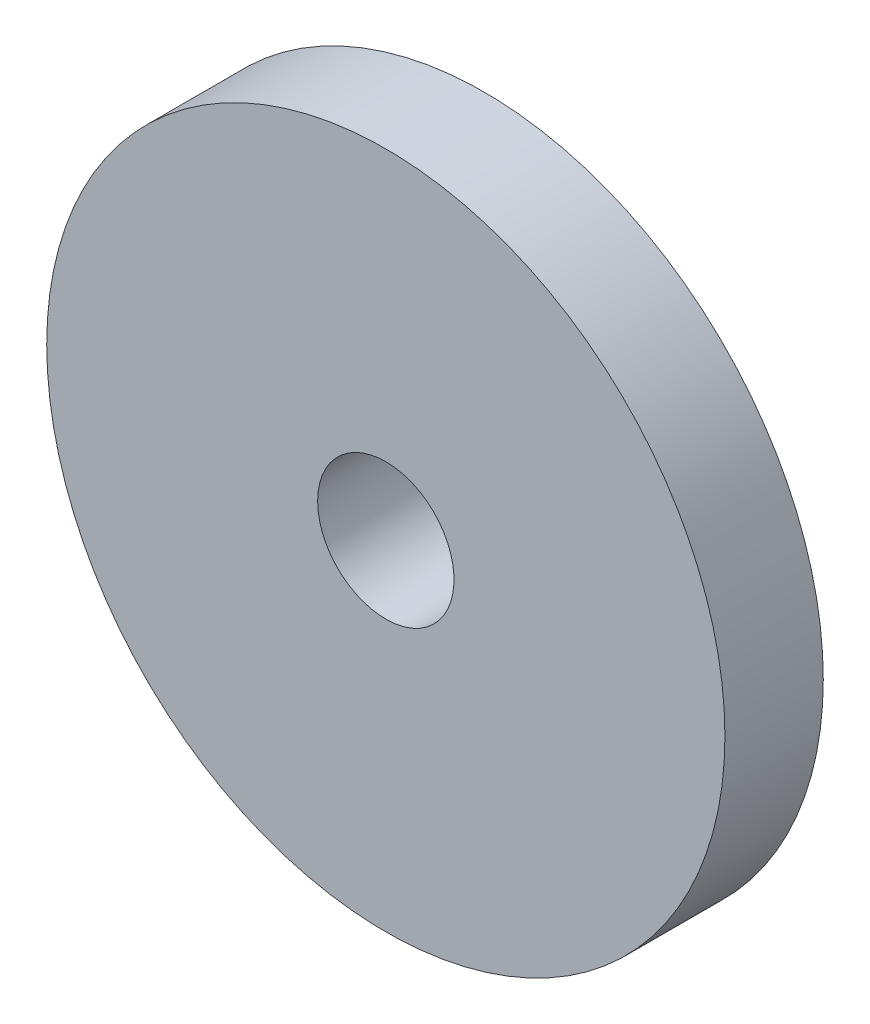
ISO-10303-21;
HEADER;
FILE_DESCRIPTION(('STEP AP214'),'2;1');
FILE_NAME('part.step','',(''),(''),'','','');
FILE_SCHEMA(('AUTOMOTIVE_DESIGN { 1 0 10303 214 1 1 1 1 }'));
ENDSEC;
DATA;
#1=APPLICATION_CONTEXT('core data for automotive mechanical design processes');
#2=APPLICATION_PROTOCOL_DEFINITION('international standard','automotive_design',2000,#1);
#3=PRODUCT_CONTEXT('',#1,'mechanical');
#4=PRODUCT('Part','Part','',(#3));
#5=PRODUCT_RELATED_PRODUCT_CATEGORY('part','',(#4));
#6=PRODUCT_DEFINITION_FORMATION('','',#4);
#7=PRODUCT_DEFINITION_CONTEXT('part definition',#1,'design');
#8=PRODUCT_DEFINITION('design','',#6,#7);
#9=PRODUCT_DEFINITION_SHAPE('','',#8);
#10=(LENGTH_UNIT() NAMED_UNIT(*) SI_UNIT(.MILLI.,.METRE.));
#11=(NAMED_UNIT(*) PLANE_ANGLE_UNIT() SI_UNIT($,.RADIAN.));
#12=(NAMED_UNIT(*) SI_UNIT($,.STERADIAN.) SOLID_ANGLE_UNIT());
#13=UNCERTAINTY_MEASURE_WITH_UNIT(LENGTH_MEASURE(1.E-05),#10,'distance_accuracy_value','');
#14=(GEOMETRIC_REPRESENTATION_CONTEXT(3) GLOBAL_UNCERTAINTY_ASSIGNED_CONTEXT((#13)) GLOBAL_UNIT_ASSIGNED_CONTEXT((#10,
#11,#12)) REPRESENTATION_CONTEXT('',''));
#15=CARTESIAN_POINT('',(0.,0.,0.));
#16=DIRECTION('',(0.,0.,1.));
#17=DIRECTION('',(1.,0.,0.));
#18=AXIS2_PLACEMENT_3D('',#15,#16,#17);
#19=CARTESIAN_POINT('',(0.,0.,4.7625));
#20=DIRECTION('',(0.,0.,1.));
#21=DIRECTION('',(1.,0.,0.));
#22=AXIS2_PLACEMENT_3D('',#19,#20,#21);
#23=PLANE('',#22);
#24=CARTESIAN_POINT('',(0.,0.,4.7625));
#25=DIRECTION('',(0.,0.,1.));
#26=DIRECTION('',(1.,0.,0.));
#27=AXIS2_PLACEMENT_3D('',#24,#25,#26);
#28=CIRCLE('',#27,16.4211);
#29=CARTESIAN_POINT('',(-16.4211,0.,4.7625));
#30=VERTEX_POINT('',#29);
#31=EDGE_CURVE('E10',#30,#30,#28,.T.);
#32=ORIENTED_EDGE('',*,*,#31,.T.);
#33=EDGE_LOOP('',(#32));
#34=FACE_BOUND('',#33,.T.);
#35=CARTESIAN_POINT('',(0.,0.,4.7625));
#36=DIRECTION('',(0.,0.,1.));
#37=DIRECTION('',(1.,0.,0.));
#38=AXIS2_PLACEMENT_3D('',#35,#36,#37);
#39=CIRCLE('',#38,3.302);
#40=CARTESIAN_POINT('',(-3.302,0.,4.7625));
#41=VERTEX_POINT('',#40);
#42=EDGE_CURVE('E42',#41,#41,#39,.T.);
#43=ORIENTED_EDGE('',*,*,#42,.F.);
#44=EDGE_LOOP('',(#43));
#45=FACE_BOUND('',#44,.T.);
#46=ADVANCED_FACE('F31',(#34,#45),#23,.T.);
#47=CARTESIAN_POINT('',(0.,0.,0.));
#48=DIRECTION('',(0.,0.,1.));
#49=DIRECTION('',(1.,0.,0.));
#50=AXIS2_PLACEMENT_3D('',#47,#48,#49);
#51=PLANE('',#50);
#52=CARTESIAN_POINT('',(0.,0.,0.));
#53=DIRECTION('',(0.,0.,1.));
#54=DIRECTION('',(1.,0.,0.));
#55=AXIS2_PLACEMENT_3D('',#52,#53,#54);
#56=CIRCLE('',#55,16.4211);
#57=CARTESIAN_POINT('',(-16.4211,0.,0.));
#58=VERTEX_POINT('',#57);
#59=EDGE_CURVE('E35',#58,#58,#56,.T.);
#60=ORIENTED_EDGE('',*,*,#59,.F.);
#61=EDGE_LOOP('',(#60));
#62=FACE_BOUND('',#61,.T.);
#63=CARTESIAN_POINT('',(0.,0.,0.));
#64=DIRECTION('',(0.,0.,1.));
#65=DIRECTION('',(1.,0.,0.));
#66=AXIS2_PLACEMENT_3D('',#63,#64,#65);
#67=CIRCLE('',#66,3.302);
#68=CARTESIAN_POINT('',(-3.302,0.,0.));
#69=VERTEX_POINT('',#68);
#70=EDGE_CURVE('E44',#69,#69,#67,.T.);
#71=ORIENTED_EDGE('',*,*,#70,.T.);
#72=EDGE_LOOP('',(#71));
#73=FACE_BOUND('',#72,.T.);
#74=ADVANCED_FACE('F54',(#62,#73),#51,.F.);
#75=CARTESIAN_POINT('',(0.,0.,4.7625));
#76=DIRECTION('',(0.,0.,-1.));
#77=DIRECTION('',(-1.,0.,0.));
#78=AXIS2_PLACEMENT_3D('',#75,#76,#77);
#79=CYLINDRICAL_SURFACE('',#78,16.4211);
#80=CARTESIAN_POINT('',(-16.4211,0.,4.7625));
#81=CARTESIAN_POINT('',(-16.4211,0.,4.712890625));
#82=CARTESIAN_POINT('',(-16.4211,0.,4.66328125));
#83=CARTESIAN_POINT('',(-16.4211,0.,4.5640625));
#84=CARTESIAN_POINT('',(-16.4211,0.,4.514453125));
#85=CARTESIAN_POINT('',(-16.4211,0.,4.415234375));
#86=CARTESIAN_POINT('',(-16.4211,0.,4.365625));
#87=CARTESIAN_POINT('',(-16.4211,0.,4.26640625));
#88=CARTESIAN_POINT('',(-16.4211,0.,4.216796875));
#89=CARTESIAN_POINT('',(-16.4211,0.,4.117578125));
#90=CARTESIAN_POINT('',(-16.4211,0.,4.06796875));
#91=CARTESIAN_POINT('',(-16.4211,0.,3.96875));
#92=CARTESIAN_POINT('',(-16.4211,0.,3.919140625));
#93=CARTESIAN_POINT('',(-16.4211,0.,3.819921875));
#94=CARTESIAN_POINT('',(-16.4211,0.,3.7703125));
#95=CARTESIAN_POINT('',(-16.4211,0.,3.67109375));
#96=CARTESIAN_POINT('',(-16.4211,0.,3.621484375));
#97=CARTESIAN_POINT('',(-16.4211,0.,3.522265625));
#98=CARTESIAN_POINT('',(-16.4211,0.,3.47265625));
#99=CARTESIAN_POINT('',(-16.4211,0.,3.3734375));
#100=CARTESIAN_POINT('',(-16.4211,0.,3.323828125));
#101=CARTESIAN_POINT('',(-16.4211,0.,3.224609375));
#102=CARTESIAN_POINT('',(-16.4211,0.,3.175));
#103=CARTESIAN_POINT('',(-16.4211,0.,3.07578125));
#104=CARTESIAN_POINT('',(-16.4211,0.,3.026171875));
#105=CARTESIAN_POINT('',(-16.4211,0.,2.926953125));
#106=CARTESIAN_POINT('',(-16.4211,0.,2.87734375));
#107=CARTESIAN_POINT('',(-16.4211,0.,2.778125));
#108=CARTESIAN_POINT('',(-16.4211,0.,2.728515625));
#109=CARTESIAN_POINT('',(-16.4211,0.,2.629296875));
#110=CARTESIAN_POINT('',(-16.4211,0.,2.5796875));
#111=CARTESIAN_POINT('',(-16.4211,0.,2.48046875));
#112=CARTESIAN_POINT('',(-16.4211,0.,2.430859375));
#113=CARTESIAN_POINT('',(-16.4211,0.,2.331640625));
#114=CARTESIAN_POINT('',(-16.4211,0.,2.28203125));
#115=CARTESIAN_POINT('',(-16.4211,0.,2.1828125));
#116=CARTESIAN_POINT('',(-16.4211,0.,2.133203125));
#117=CARTESIAN_POINT('',(-16.4211,0.,2.033984375));
#118=CARTESIAN_POINT('',(-16.4211,0.,1.984375));
#119=CARTESIAN_POINT('',(-16.4211,0.,1.88515625));
#120=CARTESIAN_POINT('',(-16.4211,0.,1.835546875));
#121=CARTESIAN_POINT('',(-16.4211,0.,1.736328125));
#122=CARTESIAN_POINT('',(-16.4211,0.,1.68671875));
#123=CARTESIAN_POINT('',(-16.4211,0.,1.5875));
#124=CARTESIAN_POINT('',(-16.4211,0.,1.537890625));
#125=CARTESIAN_POINT('',(-16.4211,0.,1.438671875));
#126=CARTESIAN_POINT('',(-16.4211,0.,1.3890625));
#127=CARTESIAN_POINT('',(-16.4211,0.,1.28984375));
#128=CARTESIAN_POINT('',(-16.4211,0.,1.240234375));
#129=CARTESIAN_POINT('',(-16.4211,0.,1.141015625));
#130=CARTESIAN_POINT('',(-16.4211,0.,1.09140625));
#131=CARTESIAN_POINT('',(-16.4211,0.,0.992187499999999));
#132=CARTESIAN_POINT('',(-16.4211,0.,0.942578124999999));
#133=CARTESIAN_POINT('',(-16.4211,0.,0.843359375));
#134=CARTESIAN_POINT('',(-16.4211,0.,0.79375));
#135=CARTESIAN_POINT('',(-16.4211,0.,0.69453125));
#136=CARTESIAN_POINT('',(-16.4211,0.,0.644921875));
#137=CARTESIAN_POINT('',(-16.4211,0.,0.545703125));
#138=CARTESIAN_POINT('',(-16.4211,0.,0.49609375));
#139=CARTESIAN_POINT('',(-16.4211,0.,0.396875));
#140=CARTESIAN_POINT('',(-16.4211,0.,0.347265625));
#141=CARTESIAN_POINT('',(-16.4211,0.,0.248046875));
#142=CARTESIAN_POINT('',(-16.4211,0.,0.1984375));
#143=CARTESIAN_POINT('',(-16.4211,0.,0.09921875));
#144=CARTESIAN_POINT('',(-16.4211,0.,0.049609375));
#145=CARTESIAN_POINT('',(-16.4211,0.,0.));
#146=B_SPLINE_CURVE_WITH_KNOTS('',3,(#80,#81,#82,#83,#84,#85,#86,#87,#88,#89,#90,#91,#92,#93,
#94,#95,#96,#97,#98,#99,#100,#101,#102,#103,#104,#105,#106,#107,#108,#109,#110,#111,#112,#113,
#114,#115,#116,#117,#118,#119,#120,#121,#122,#123,#124,#125,#126,#127,#128,#129,#130,#131,#132,
#133,#134,#135,#136,#137,#138,#139,#140,#141,#142,#143,#144,#145),.UNSPECIFIED.,.F.,.F.,(4,2,2,
2,2,2,2,2,2,2,2,2,2,2,2,2,2,2,2,2,2,2,2,2,2,2,2,2,2,2,2,2,4),(0.,0.148828125,0.29765625,
0.446484375,0.5953125,0.744140625,0.892968750000001,1.041796875,1.190625,1.339453125,1.48828125,
1.637109375,1.7859375,1.934765625,2.08359375,2.232421875,2.38125,2.530078125,2.67890625,
2.827734375,2.9765625,3.125390625,3.27421875,3.423046875,3.571875,3.720703125,3.86953125,
4.018359375,4.1671875,4.316015625,4.46484375,4.613671875,4.7625),.UNSPECIFIED.);
#147=EDGE_CURVE('BSEAM33',#30,#58,#146,.T.);
#148=ORIENTED_EDGE('',*,*,#31,.F.);
#149=ORIENTED_EDGE('',*,*,#59,.T.);
#150=ORIENTED_EDGE('',*,*,#147,.T.);
#151=ORIENTED_EDGE('',*,*,#147,.F.);
#152=EDGE_LOOP('',(#148,#150,#149,#151));
#153=FACE_BOUND('',#152,.T.);
#154=ADVANCED_FACE('F33',(#153),#79,.T.);
#155=CARTESIAN_POINT('',(0.,0.,4.7625));
#156=DIRECTION('',(0.,0.,-1.));
#157=DIRECTION('',(-1.,0.,0.));
#158=AXIS2_PLACEMENT_3D('',#155,#156,#157);
#159=CYLINDRICAL_SURFACE('',#158,3.302);
#160=CARTESIAN_POINT('',(-3.302,0.,4.7625));
#161=CARTESIAN_POINT('',(-3.302,0.,4.712890625));
#162=CARTESIAN_POINT('',(-3.302,0.,4.66328125));
#163=CARTESIAN_POINT('',(-3.302,0.,4.5640625));
#164=CARTESIAN_POINT('',(-3.302,0.,4.514453125));
#165=CARTESIAN_POINT('',(-3.302,0.,4.415234375));
#166=CARTESIAN_POINT('',(-3.302,0.,4.365625));
#167=CARTESIAN_POINT('',(-3.302,0.,4.26640625));
#168=CARTESIAN_POINT('',(-3.302,0.,4.216796875));
#169=CARTESIAN_POINT('',(-3.302,0.,4.117578125));
#170=CARTESIAN_POINT('',(-3.302,0.,4.06796875));
#171=CARTESIAN_POINT('',(-3.302,0.,3.96875));
#172=CARTESIAN_POINT('',(-3.302,0.,3.919140625));
#173=CARTESIAN_POINT('',(-3.302,0.,3.819921875));
#174=CARTESIAN_POINT('',(-3.302,0.,3.7703125));
#175=CARTESIAN_POINT('',(-3.302,0.,3.67109375));
#176=CARTESIAN_POINT('',(-3.302,0.,3.621484375));
#177=CARTESIAN_POINT('',(-3.302,0.,3.522265625));
#178=CARTESIAN_POINT('',(-3.302,0.,3.47265625));
#179=CARTESIAN_POINT('',(-3.302,0.,3.3734375));
#180=CARTESIAN_POINT('',(-3.302,0.,3.323828125));
#181=CARTESIAN_POINT('',(-3.302,0.,3.224609375));
#182=CARTESIAN_POINT('',(-3.302,0.,3.175));
#183=CARTESIAN_POINT('',(-3.302,0.,3.07578125));
#184=CARTESIAN_POINT('',(-3.302,0.,3.026171875));
#185=CARTESIAN_POINT('',(-3.302,0.,2.926953125));
#186=CARTESIAN_POINT('',(-3.302,0.,2.87734375));
#187=CARTESIAN_POINT('',(-3.302,0.,2.778125));
#188=CARTESIAN_POINT('',(-3.302,0.,2.728515625));
#189=CARTESIAN_POINT('',(-3.302,0.,2.629296875));
#190=CARTESIAN_POINT('',(-3.302,0.,2.5796875));
#191=CARTESIAN_POINT('',(-3.302,0.,2.48046875));
#192=CARTESIAN_POINT('',(-3.302,0.,2.430859375));
#193=CARTESIAN_POINT('',(-3.302,0.,2.331640625));
#194=CARTESIAN_POINT('',(-3.302,0.,2.28203125));
#195=CARTESIAN_POINT('',(-3.302,0.,2.1828125));
#196=CARTESIAN_POINT('',(-3.302,0.,2.133203125));
#197=CARTESIAN_POINT('',(-3.302,0.,2.033984375));
#198=CARTESIAN_POINT('',(-3.302,0.,1.984375));
#199=CARTESIAN_POINT('',(-3.302,0.,1.88515625));
#200=CARTESIAN_POINT('',(-3.302,0.,1.835546875));
#201=CARTESIAN_POINT('',(-3.302,0.,1.736328125));
#202=CARTESIAN_POINT('',(-3.302,0.,1.68671875));
#203=CARTESIAN_POINT('',(-3.302,0.,1.5875));
#204=CARTESIAN_POINT('',(-3.302,0.,1.537890625));
#205=CARTESIAN_POINT('',(-3.302,0.,1.438671875));
#206=CARTESIAN_POINT('',(-3.302,0.,1.3890625));
#207=CARTESIAN_POINT('',(-3.302,0.,1.28984375));
#208=CARTESIAN_POINT('',(-3.302,0.,1.240234375));
#209=CARTESIAN_POINT('',(-3.302,0.,1.141015625));
#210=CARTESIAN_POINT('',(-3.302,0.,1.09140625));
#211=CARTESIAN_POINT('',(-3.302,0.,0.9921875));
#212=CARTESIAN_POINT('',(-3.302,0.,0.942578125));
#213=CARTESIAN_POINT('',(-3.302,0.,0.843359375));
#214=CARTESIAN_POINT('',(-3.302,0.,0.79375));
#215=CARTESIAN_POINT('',(-3.302,0.,0.69453125));
#216=CARTESIAN_POINT('',(-3.302,0.,0.644921875));
#217=CARTESIAN_POINT('',(-3.302,0.,0.545703125));
#218=CARTESIAN_POINT('',(-3.302,0.,0.49609375));
#219=CARTESIAN_POINT('',(-3.302,0.,0.396875));
#220=CARTESIAN_POINT('',(-3.302,0.,0.347265625));
#221=CARTESIAN_POINT('',(-3.302,0.,0.248046875));
#222=CARTESIAN_POINT('',(-3.302,0.,0.1984375));
#223=CARTESIAN_POINT('',(-3.302,0.,0.09921875));
#224=CARTESIAN_POINT('',(-3.302,0.,0.049609375));
#225=CARTESIAN_POINT('',(-3.302,0.,0.));
#226=B_SPLINE_CURVE_WITH_KNOTS('',3,(#160,#161,#162,#163,#164,#165,#166,#167,#168,#169,#170,
#171,#172,#173,#174,#175,#176,#177,#178,#179,#180,#181,#182,#183,#184,#185,#186,#187,#188,#189,
#190,#191,#192,#193,#194,#195,#196,#197,#198,#199,#200,#201,#202,#203,#204,#205,#206,#207,#208,
#209,#210,#211,#212,#213,#214,#215,#216,#217,#218,#219,#220,#221,#222,#223,#224,#225),
.UNSPECIFIED.,.F.,.F.,(4,2,2,2,2,2,2,2,2,2,2,2,2,2,2,2,2,2,2,2,2,2,2,2,2,2,2,2,2,2,2,2,4),(0.,
0.148828124999999,0.297656249999999,0.446484374999999,0.595312499999999,0.744140625,0.89296875,
1.041796875,1.190625,1.339453125,1.48828125,1.637109375,1.7859375,1.934765625,2.08359375,
2.232421875,2.38125,2.530078125,2.67890625,2.827734375,2.9765625,3.125390625,3.27421875,
3.423046875,3.571875,3.720703125,3.86953125,4.018359375,4.1671875,4.316015625,4.46484375,
4.613671875,4.7625),.UNSPECIFIED.);
#227=EDGE_CURVE('BSEAM50',#41,#69,#226,.T.);
#228=ORIENTED_EDGE('',*,*,#42,.T.);
#229=ORIENTED_EDGE('',*,*,#70,.F.);
#230=ORIENTED_EDGE('',*,*,#227,.T.);
#231=ORIENTED_EDGE('',*,*,#227,.F.);
#232=EDGE_LOOP('',(#228,#230,#229,#231));
#233=FACE_BOUND('',#232,.T.);
#234=ADVANCED_FACE('F50',(#233),#159,.F.);
#235=CLOSED_SHELL('',(#46,#74,#154,#234));
#236=MANIFOLD_SOLID_BREP('B2',#235);
#237=ADVANCED_BREP_SHAPE_REPRESENTATION('',(#18,#236),#14);
#238=SHAPE_DEFINITION_REPRESENTATION(#9,#237);
ENDSEC;
END-ISO-10303-21;
